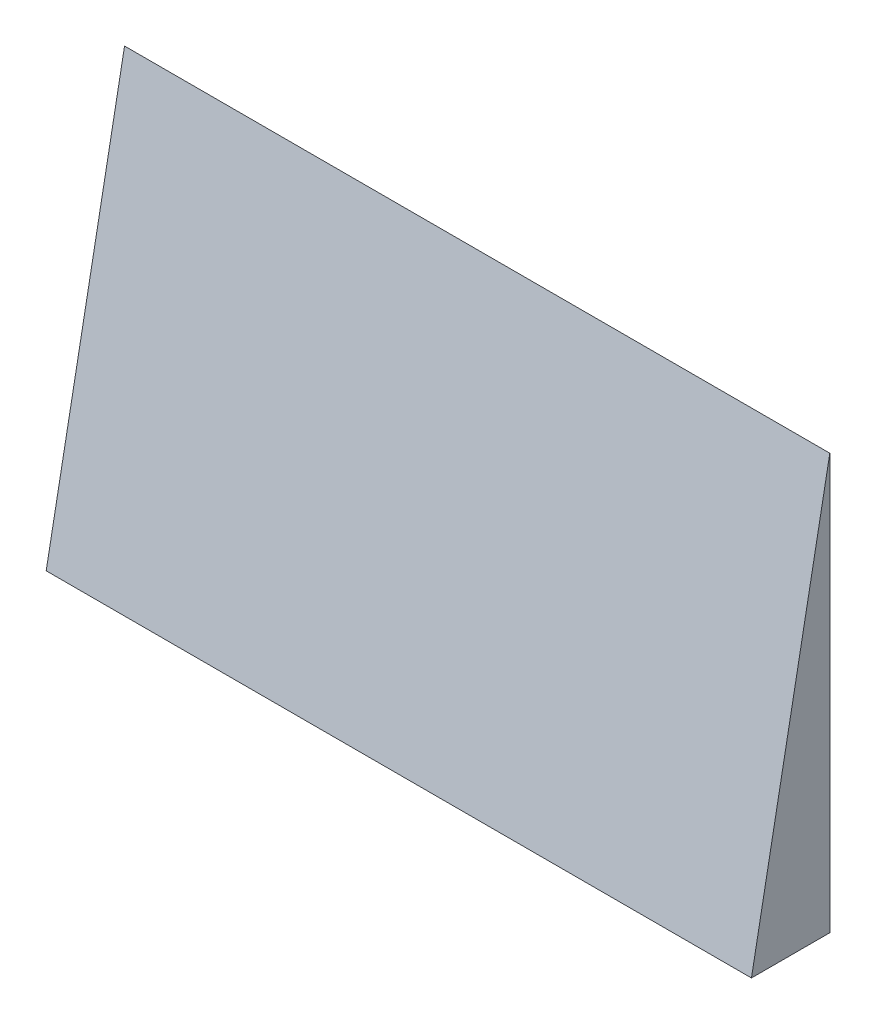
ISO-10303-21;
HEADER;
FILE_DESCRIPTION(('STEP AP214'),'2;1');
FILE_NAME('part.step','',(''),(''),'','','');
FILE_SCHEMA(('AUTOMOTIVE_DESIGN { 1 0 10303 214 1 1 1 1 }'));
ENDSEC;
DATA;
#1=APPLICATION_CONTEXT('core data for automotive mechanical design processes');
#2=APPLICATION_PROTOCOL_DEFINITION('international standard','automotive_design',2000,#1);
#3=PRODUCT_CONTEXT('',#1,'mechanical');
#4=PRODUCT('Part','Part','',(#3));
#5=PRODUCT_RELATED_PRODUCT_CATEGORY('part','',(#4));
#6=PRODUCT_DEFINITION_FORMATION('','',#4);
#7=PRODUCT_DEFINITION_CONTEXT('part definition',#1,'design');
#8=PRODUCT_DEFINITION('design','',#6,#7);
#9=PRODUCT_DEFINITION_SHAPE('','',#8);
#10=(LENGTH_UNIT() NAMED_UNIT(*) SI_UNIT(.MILLI.,.METRE.));
#11=(NAMED_UNIT(*) PLANE_ANGLE_UNIT() SI_UNIT($,.RADIAN.));
#12=(NAMED_UNIT(*) SI_UNIT($,.STERADIAN.) SOLID_ANGLE_UNIT());
#13=UNCERTAINTY_MEASURE_WITH_UNIT(LENGTH_MEASURE(1.E-05),#10,'distance_accuracy_value','');
#14=(GEOMETRIC_REPRESENTATION_CONTEXT(3) GLOBAL_UNCERTAINTY_ASSIGNED_CONTEXT((#13)) GLOBAL_UNIT_ASSIGNED_CONTEXT((#10,
#11,#12)) REPRESENTATION_CONTEXT('',''));
#15=CARTESIAN_POINT('',(0.,0.,0.));
#16=DIRECTION('',(0.,0.,1.));
#17=DIRECTION('',(1.,0.,0.));
#18=AXIS2_PLACEMENT_3D('',#15,#16,#17);
#19=CARTESIAN_POINT('',(0.,0.,0.));
#20=DIRECTION('',(0.,0.,-1.));
#21=DIRECTION('',(-1.,0.,0.));
#22=AXIS2_PLACEMENT_3D('',#19,#20,#21);
#23=PLANE('',#22);
#24=DIRECTION('',(0.,1.,0.));
#25=VECTOR('',#24,1.);
#26=CARTESIAN_POINT('',(450.,0.,0.));
#27=LINE('',#26,#25);
#28=CARTESIAN_POINT('',(450.,265.,0.));
#29=VERTEX_POINT('',#28);
#30=CARTESIAN_POINT('',(450.,0.,0.));
#31=VERTEX_POINT('',#30);
#32=EDGE_CURVE('E20',#29,#31,#27,.F.);
#33=ORIENTED_EDGE('',*,*,#32,.T.);
#34=DIRECTION('',(1.,0.,0.));
#35=VECTOR('',#34,1.);
#36=CARTESIAN_POINT('',(0.,0.,0.));
#37=LINE('',#36,#35);
#38=CARTESIAN_POINT('',(0.,0.,0.));
#39=VERTEX_POINT('',#38);
#40=EDGE_CURVE('E52',#31,#39,#37,.F.);
#41=ORIENTED_EDGE('',*,*,#40,.T.);
#42=DIRECTION('',(0.,1.,0.));
#43=VECTOR('',#42,1.);
#44=CARTESIAN_POINT('',(0.,0.,0.));
#45=LINE('',#44,#43);
#46=CARTESIAN_POINT('',(0.,265.,0.));
#47=VERTEX_POINT('',#46);
#48=EDGE_CURVE('E46',#39,#47,#45,.T.);
#49=ORIENTED_EDGE('',*,*,#48,.T.);
#50=DIRECTION('',(1.,0.,0.));
#51=VECTOR('',#50,1.);
#52=CARTESIAN_POINT('',(450.,265.,0.));
#53=LINE('',#52,#51);
#54=EDGE_CURVE('E53',#47,#29,#53,.T.);
#55=ORIENTED_EDGE('',*,*,#54,.T.);
#56=EDGE_LOOP('',(#33,#41,#49,#55));
#57=FACE_BOUND('',#56,.T.);
#58=ADVANCED_FACE('F17',(#57),#23,.T.);
#59=CARTESIAN_POINT('',(450.,0.,50.));
#60=DIRECTION('',(-1.,0.,0.));
#61=DIRECTION('',(0.,0.,1.));
#62=AXIS2_PLACEMENT_3D('',#59,#60,#61);
#63=PLANE('',#62);
#64=DIRECTION('',(0.,0.982661653748471,-0.185407859197825));
#65=VECTOR('',#64,1.);
#66=CARTESIAN_POINT('',(450.,9.1096596768649,48.281196287384));
#67=LINE('',#66,#65);
#68=CARTESIAN_POINT('',(450.,0.,50.));
#69=VERTEX_POINT('',#68);
#70=EDGE_CURVE('E65',#29,#69,#67,.F.);
#71=ORIENTED_EDGE('',*,*,#70,.T.);
#72=DIRECTION('',(0.,0.,1.));
#73=VECTOR('',#72,1.);
#74=CARTESIAN_POINT('',(450.,0.,50.));
#75=LINE('',#74,#73);
#76=EDGE_CURVE('E58',#69,#31,#75,.F.);
#77=ORIENTED_EDGE('',*,*,#76,.T.);
#78=ORIENTED_EDGE('',*,*,#32,.F.);
#79=EDGE_LOOP('',(#71,#77,#78));
#80=FACE_BOUND('',#79,.T.);
#81=ADVANCED_FACE('F64',(#80),#63,.F.);
#82=CARTESIAN_POINT('',(0.,0.,50.));
#83=DIRECTION('',(0.,1.,0.));
#84=DIRECTION('',(0.,0.,1.));
#85=AXIS2_PLACEMENT_3D('',#82,#83,#84);
#86=PLANE('',#85);
#87=ORIENTED_EDGE('',*,*,#76,.F.);
#88=DIRECTION('',(1.,0.,0.));
#89=VECTOR('',#88,1.);
#90=CARTESIAN_POINT('',(450.,0.,50.));
#91=LINE('',#90,#89);
#92=CARTESIAN_POINT('',(0.,0.,50.));
#93=VERTEX_POINT('',#92);
#94=EDGE_CURVE('E26',#69,#93,#91,.F.);
#95=ORIENTED_EDGE('',*,*,#94,.T.);
#96=DIRECTION('',(0.,0.,-1.));
#97=VECTOR('',#96,1.);
#98=CARTESIAN_POINT('',(0.,0.,50.));
#99=LINE('',#98,#97);
#100=EDGE_CURVE('E34',#93,#39,#99,.T.);
#101=ORIENTED_EDGE('',*,*,#100,.T.);
#102=ORIENTED_EDGE('',*,*,#40,.F.);
#103=EDGE_LOOP('',(#87,#95,#101,#102));
#104=FACE_BOUND('',#103,.T.);
#105=ADVANCED_FACE('F60',(#104),#86,.F.);
#106=CARTESIAN_POINT('',(0.,0.,50.));
#107=DIRECTION('',(1.,0.,0.));
#108=DIRECTION('',(0.,0.,-1.));
#109=AXIS2_PLACEMENT_3D('',#106,#107,#108);
#110=PLANE('',#109);
#111=DIRECTION('',(0.,0.982661653748471,-0.185407859197825));
#112=VECTOR('',#111,1.);
#113=CARTESIAN_POINT('',(-2.22044604925031E-13,9.1096596768649,48.281196287384));
#114=LINE('',#113,#112);
#115=EDGE_CURVE('E11',#93,#47,#114,.T.);
#116=ORIENTED_EDGE('',*,*,#115,.T.);
#117=ORIENTED_EDGE('',*,*,#48,.F.);
#118=ORIENTED_EDGE('',*,*,#100,.F.);
#119=EDGE_LOOP('',(#116,#117,#118));
#120=FACE_BOUND('',#119,.T.);
#121=ADVANCED_FACE('F73',(#120),#110,.F.);
#122=CARTESIAN_POINT('',(450.,9.1096596768649,48.281196287384));
#123=DIRECTION('',(0.,-0.185407859197825,-0.982661653748471));
#124=DIRECTION('',(0.,0.982661653748471,-0.185407859197825));
#125=AXIS2_PLACEMENT_3D('',#122,#123,#124);
#126=PLANE('',#125);
#127=ORIENTED_EDGE('',*,*,#94,.F.);
#128=ORIENTED_EDGE('',*,*,#70,.F.);
#129=ORIENTED_EDGE('',*,*,#54,.F.);
#130=ORIENTED_EDGE('',*,*,#115,.F.);
#131=EDGE_LOOP('',(#127,#128,#129,#130));
#132=FACE_BOUND('',#131,.T.);
#133=ADVANCED_FACE('F72',(#132),#126,.F.);
#134=CLOSED_SHELL('',(#58,#81,#105,#121,#133));
#135=MANIFOLD_SOLID_BREP('B1',#134);
#136=ADVANCED_BREP_SHAPE_REPRESENTATION('',(#18,#135),#14);
#137=SHAPE_DEFINITION_REPRESENTATION(#9,#136);
ENDSEC;
END-ISO-10303-21;
